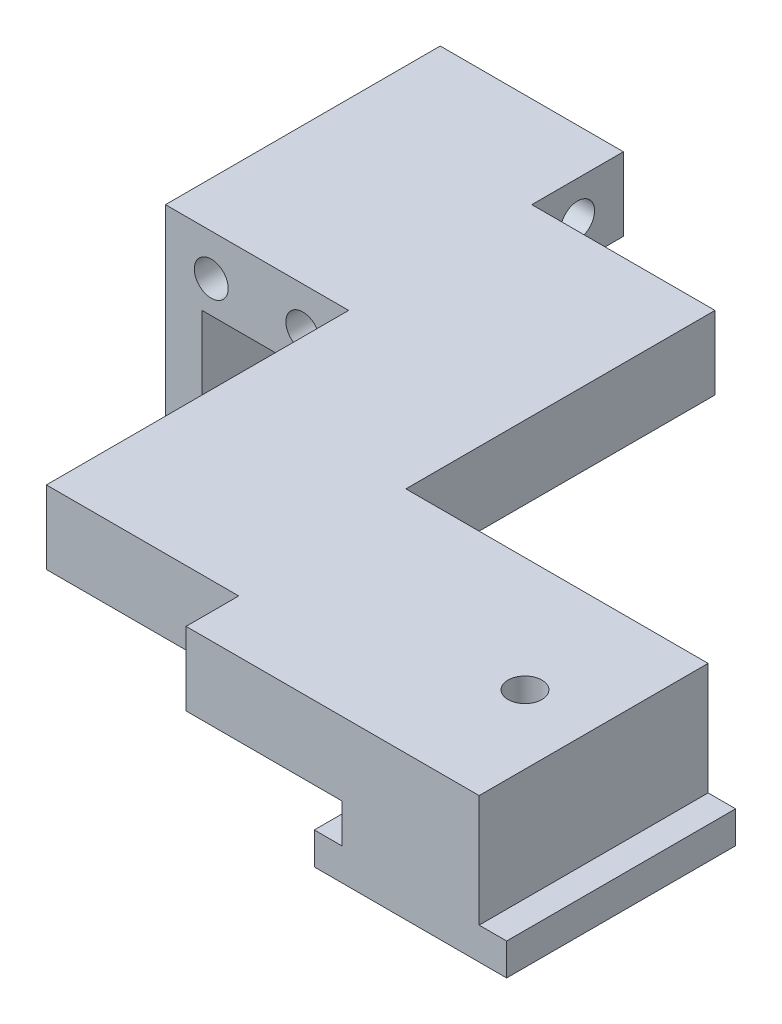
ISO-10303-21;
HEADER;
FILE_DESCRIPTION(('STEP AP214'),'2;1');
FILE_NAME('part.step','',(''),(''),'','','');
FILE_SCHEMA(('AUTOMOTIVE_DESIGN { 1 0 10303 214 1 1 1 1 }'));
ENDSEC;
DATA;
#1=APPLICATION_CONTEXT('core data for automotive mechanical design processes');
#2=APPLICATION_PROTOCOL_DEFINITION('international standard','automotive_design',2000,#1);
#3=PRODUCT_CONTEXT('',#1,'mechanical');
#4=PRODUCT('Part','Part','',(#3));
#5=PRODUCT_RELATED_PRODUCT_CATEGORY('part','',(#4));
#6=PRODUCT_DEFINITION_FORMATION('','',#4);
#7=PRODUCT_DEFINITION_CONTEXT('part definition',#1,'design');
#8=PRODUCT_DEFINITION('design','',#6,#7);
#9=PRODUCT_DEFINITION_SHAPE('','',#8);
#10=(LENGTH_UNIT() NAMED_UNIT(*) SI_UNIT(.MILLI.,.METRE.));
#11=(NAMED_UNIT(*) PLANE_ANGLE_UNIT() SI_UNIT($,.RADIAN.));
#12=(NAMED_UNIT(*) SI_UNIT($,.STERADIAN.) SOLID_ANGLE_UNIT());
#13=UNCERTAINTY_MEASURE_WITH_UNIT(LENGTH_MEASURE(1.E-05),#10,'distance_accuracy_value','');
#14=(GEOMETRIC_REPRESENTATION_CONTEXT(3) GLOBAL_UNCERTAINTY_ASSIGNED_CONTEXT((#13)) GLOBAL_UNIT_ASSIGNED_CONTEXT((#10,
#11,#12)) REPRESENTATION_CONTEXT('',''));
#15=CARTESIAN_POINT('',(0.,0.,0.));
#16=DIRECTION('',(0.,0.,1.));
#17=DIRECTION('',(1.,0.,0.));
#18=AXIS2_PLACEMENT_3D('',#15,#16,#17);
#19=CARTESIAN_POINT('',(-61.5,-7.74999999999999,-56.25));
#20=DIRECTION('',(-1.,0.,0.));
#21=DIRECTION('',(0.,-1.,0.));
#22=AXIS2_PLACEMENT_3D('',#19,#20,#21);
#23=PLANE('',#22);
#24=DIRECTION('',(0.,0.,1.));
#25=VECTOR('',#24,1.);
#26=CARTESIAN_POINT('',(-61.5,-5.49999999999999,-26.25));
#27=LINE('',#26,#25);
#28=CARTESIAN_POINT('',(-61.5,-5.49999999999999,-56.25));
#29=VERTEX_POINT('',#28);
#30=CARTESIAN_POINT('',(-61.5,-5.49999999999999,-26.25));
#31=VERTEX_POINT('',#30);
#32=EDGE_CURVE('E221',#29,#31,#27,.T.);
#33=ORIENTED_EDGE('',*,*,#32,.F.);
#34=DIRECTION('',(0.,1.,0.));
#35=VECTOR('',#34,1.);
#36=CARTESIAN_POINT('',(-61.5,-7.74999999999999,-56.25));
#37=LINE('',#36,#35);
#38=CARTESIAN_POINT('',(-61.5,7.75000000000001,-56.25));
#39=VERTEX_POINT('',#38);
#40=EDGE_CURVE('E238',#29,#39,#37,.T.);
#41=ORIENTED_EDGE('',*,*,#40,.T.);
#42=DIRECTION('',(0.,0.,1.));
#43=VECTOR('',#42,1.);
#44=CARTESIAN_POINT('',(-61.5,7.75000000000001,-56.25));
#45=LINE('',#44,#43);
#46=CARTESIAN_POINT('',(-61.5,7.75000000000001,-26.25));
#47=VERTEX_POINT('',#46);
#48=EDGE_CURVE('E231',#39,#47,#45,.T.);
#49=ORIENTED_EDGE('',*,*,#48,.T.);
#50=DIRECTION('',(0.,1.,0.));
#51=VECTOR('',#50,1.);
#52=CARTESIAN_POINT('',(-61.5,-7.74999999999999,-26.25));
#53=LINE('',#52,#51);
#54=EDGE_CURVE('E206',#31,#47,#53,.T.);
#55=ORIENTED_EDGE('',*,*,#54,.F.);
#56=EDGE_LOOP('',(#33,#41,#49,#55));
#57=FACE_BOUND('',#56,.T.);
#58=ADVANCED_FACE('F39',(#57),#23,.F.);
#59=CARTESIAN_POINT('',(-45.5,7.75000000000001,-12.5));
#60=DIRECTION('',(0.,1.,0.));
#61=DIRECTION('',(-1.,0.,0.));
#62=AXIS2_PLACEMENT_3D('',#59,#60,#61);
#63=PLANE('',#62);
#64=ORIENTED_EDGE('',*,*,#48,.F.);
#65=DIRECTION('',(-1.,0.,0.));
#66=VECTOR('',#65,1.);
#67=CARTESIAN_POINT('',(-65.5,7.75000000000001,-56.25));
#68=LINE('',#67,#66);
#69=CARTESIAN_POINT('',(-45.5,7.75000000000001,-56.25));
#70=VERTEX_POINT('',#69);
#71=EDGE_CURVE('E282',#70,#39,#68,.T.);
#72=ORIENTED_EDGE('',*,*,#71,.F.);
#73=DIRECTION('',(0.,0.,1.));
#74=VECTOR('',#73,1.);
#75=CARTESIAN_POINT('',(-45.5,7.75000000000001,-56.25));
#76=LINE('',#75,#74);
#77=CARTESIAN_POINT('',(-45.5,7.75000000000001,-46.25));
#78=VERTEX_POINT('',#77);
#79=EDGE_CURVE('E285',#70,#78,#76,.T.);
#80=ORIENTED_EDGE('',*,*,#79,.T.);
#81=DIRECTION('',(-1.,0.,0.));
#82=VECTOR('',#81,1.);
#83=CARTESIAN_POINT('',(-25.5,7.75000000000001,-46.25));
#84=LINE('',#83,#82);
#85=CARTESIAN_POINT('',(-25.5,7.75000000000001,-46.25));
#86=VERTEX_POINT('',#85);
#87=EDGE_CURVE('E306',#86,#78,#84,.T.);
#88=ORIENTED_EDGE('',*,*,#87,.F.);
#89=DIRECTION('',(0.,0.,1.));
#90=VECTOR('',#89,1.);
#91=CARTESIAN_POINT('',(-25.5,7.75000000000001,-46.25));
#92=LINE('',#91,#90);
#93=CARTESIAN_POINT('',(-25.5,7.75000000000001,-12.5));
#94=VERTEX_POINT('',#93);
#95=EDGE_CURVE('E315',#86,#94,#92,.T.);
#96=ORIENTED_EDGE('',*,*,#95,.T.);
#97=DIRECTION('',(1.,0.,0.));
#98=VECTOR('',#97,1.);
#99=CARTESIAN_POINT('',(-45.5,7.75000000000001,-12.5));
#100=LINE('',#99,#98);
#101=CARTESIAN_POINT('',(-7.5,7.75,-12.5));
#102=VERTEX_POINT('',#101);
#103=EDGE_CURVE('E328',#94,#102,#100,.T.);
#104=ORIENTED_EDGE('',*,*,#103,.T.);
#105=DIRECTION('',(0.,0.,1.));
#106=VECTOR('',#105,1.);
#107=CARTESIAN_POINT('',(-7.5,7.75,-12.5));
#108=LINE('',#107,#106);
#109=CARTESIAN_POINT('',(-7.5,7.75,12.5));
#110=VERTEX_POINT('',#109);
#111=EDGE_CURVE('E318',#102,#110,#108,.T.);
#112=ORIENTED_EDGE('',*,*,#111,.T.);
#113=DIRECTION('',(1.,0.,0.));
#114=VECTOR('',#113,1.);
#115=CARTESIAN_POINT('',(-45.5,7.75000000000001,12.5));
#116=LINE('',#115,#114);
#117=CARTESIAN_POINT('',(-24.5,7.75,12.5));
#118=VERTEX_POINT('',#117);
#119=EDGE_CURVE('E324',#118,#110,#116,.T.);
#120=ORIENTED_EDGE('',*,*,#119,.F.);
#121=DIRECTION('',(0.,0.,-1.));
#122=VECTOR('',#121,1.);
#123=CARTESIAN_POINT('',(-24.5,7.75,-12.5));
#124=LINE('',#123,#122);
#125=CARTESIAN_POINT('',(-24.5,7.75,6.75));
#126=VERTEX_POINT('',#125);
#127=EDGE_CURVE('E11',#118,#126,#124,.T.);
#128=ORIENTED_EDGE('',*,*,#127,.T.);
#129=DIRECTION('',(-1.,0.,0.));
#130=VECTOR('',#129,1.);
#131=CARTESIAN_POINT('',(-45.5,7.75000000000001,6.75));
#132=LINE('',#131,#130);
#133=CARTESIAN_POINT('',(-45.5,7.75000000000001,6.75));
#134=VERTEX_POINT('',#133);
#135=EDGE_CURVE('E247',#126,#134,#132,.T.);
#136=ORIENTED_EDGE('',*,*,#135,.T.);
#137=DIRECTION('',(0.,0.,1.));
#138=VECTOR('',#137,1.);
#139=CARTESIAN_POINT('',(-45.5,7.75000000000001,-12.5));
#140=LINE('',#139,#138);
#141=CARTESIAN_POINT('',(-45.5,7.75000000000001,-26.25));
#142=VERTEX_POINT('',#141);
#143=EDGE_CURVE('E319',#142,#134,#140,.T.);
#144=ORIENTED_EDGE('',*,*,#143,.F.);
#145=DIRECTION('',(1.,0.,0.));
#146=VECTOR('',#145,1.);
#147=CARTESIAN_POINT('',(-65.5,7.75000000000001,-26.25));
#148=LINE('',#147,#146);
#149=EDGE_CURVE('E300',#47,#142,#148,.T.);
#150=ORIENTED_EDGE('',*,*,#149,.F.);
#151=EDGE_LOOP('',(#64,#72,#80,#88,#96,#104,#112,#120,#128,#136,#144,#150));
#152=FACE_BOUND('',#151,.T.);
#153=ADVANCED_FACE('F393',(#152),#63,.F.);
#154=CARTESIAN_POINT('',(0.,0.,-12.5));
#155=DIRECTION('',(0.,0.,1.));
#156=DIRECTION('',(1.,0.,0.));
#157=AXIS2_PLACEMENT_3D('',#154,#155,#156);
#158=PLANE('',#157);
#159=DIRECTION('',(0.,-1.,0.));
#160=VECTOR('',#159,1.);
#161=CARTESIAN_POINT('',(-25.5,15.75,-12.5));
#162=LINE('',#161,#160);
#163=CARTESIAN_POINT('',(-25.5,15.75,-12.5));
#164=VERTEX_POINT('',#163);
#165=EDGE_CURVE('E302',#164,#94,#162,.T.);
#166=ORIENTED_EDGE('',*,*,#165,.F.);
#167=DIRECTION('',(-1.,0.,0.));
#168=VECTOR('',#167,1.);
#169=CARTESIAN_POINT('',(7.5,15.75,-12.5));
#170=LINE('',#169,#168);
#171=CARTESIAN_POINT('',(7.5,15.75,-12.5));
#172=VERTEX_POINT('',#171);
#173=EDGE_CURVE('E361',#172,#164,#170,.T.);
#174=ORIENTED_EDGE('',*,*,#173,.F.);
#175=DIRECTION('',(0.,1.,0.));
#176=VECTOR('',#175,1.);
#177=CARTESIAN_POINT('',(7.5,3.5,-12.5));
#178=LINE('',#177,#176);
#179=CARTESIAN_POINT('',(7.5,3.5,-12.5));
#180=VERTEX_POINT('',#179);
#181=EDGE_CURVE('E359',#180,#172,#178,.T.);
#182=ORIENTED_EDGE('',*,*,#181,.F.);
#183=DIRECTION('',(-1.,0.,0.));
#184=VECTOR('',#183,1.);
#185=CARTESIAN_POINT('',(10.5,3.5,-12.5));
#186=LINE('',#185,#184);
#187=CARTESIAN_POINT('',(10.5,3.5,-12.5));
#188=VERTEX_POINT('',#187);
#189=EDGE_CURVE('E357',#188,#180,#186,.T.);
#190=ORIENTED_EDGE('',*,*,#189,.F.);
#191=DIRECTION('',(0.,1.,0.));
#192=VECTOR('',#191,1.);
#193=CARTESIAN_POINT('',(10.5,0.,-12.5));
#194=LINE('',#193,#192);
#195=CARTESIAN_POINT('',(10.5,0.,-12.5));
#196=VERTEX_POINT('',#195);
#197=EDGE_CURVE('E355',#196,#188,#194,.T.);
#198=ORIENTED_EDGE('',*,*,#197,.F.);
#199=DIRECTION('',(1.,0.,0.));
#200=VECTOR('',#199,1.);
#201=CARTESIAN_POINT('',(-10.5,0.,-12.5));
#202=LINE('',#201,#200);
#203=CARTESIAN_POINT('',(-10.5,0.,-12.5));
#204=VERTEX_POINT('',#203);
#205=EDGE_CURVE('E353',#204,#196,#202,.T.);
#206=ORIENTED_EDGE('',*,*,#205,.F.);
#207=DIRECTION('',(0.,-1.,0.));
#208=VECTOR('',#207,1.);
#209=CARTESIAN_POINT('',(-10.5,3.5,-12.5));
#210=LINE('',#209,#208);
#211=CARTESIAN_POINT('',(-10.5,3.5,-12.5));
#212=VERTEX_POINT('',#211);
#213=EDGE_CURVE('E330',#212,#204,#210,.T.);
#214=ORIENTED_EDGE('',*,*,#213,.F.);
#215=DIRECTION('',(-1.,0.,0.));
#216=VECTOR('',#215,1.);
#217=CARTESIAN_POINT('',(-7.5,3.5,-12.5));
#218=LINE('',#217,#216);
#219=CARTESIAN_POINT('',(-7.5,3.5,-12.5));
#220=VERTEX_POINT('',#219);
#221=EDGE_CURVE('E335',#220,#212,#218,.T.);
#222=ORIENTED_EDGE('',*,*,#221,.F.);
#223=DIRECTION('',(0.,-1.,0.));
#224=VECTOR('',#223,1.);
#225=CARTESIAN_POINT('',(-7.5,15.75,-12.5));
#226=LINE('',#225,#224);
#227=EDGE_CURVE('E364',#102,#220,#226,.T.);
#228=ORIENTED_EDGE('',*,*,#227,.F.);
#229=ORIENTED_EDGE('',*,*,#103,.F.);
#230=EDGE_LOOP('',(#166,#174,#182,#190,#198,#206,#214,#222,#228,#229));
#231=FACE_BOUND('',#230,.T.);
#232=ADVANCED_FACE('F427',(#231),#158,.F.);
#233=CARTESIAN_POINT('',(-7.5,15.75,12.5));
#234=DIRECTION('',(1.,0.,0.));
#235=DIRECTION('',(0.,1.,0.));
#236=AXIS2_PLACEMENT_3D('',#233,#234,#235);
#237=PLANE('',#236);
#238=ORIENTED_EDGE('',*,*,#111,.F.);
#239=ORIENTED_EDGE('',*,*,#227,.T.);
#240=DIRECTION('',(0.,0.,-1.));
#241=VECTOR('',#240,1.);
#242=CARTESIAN_POINT('',(-7.5,3.5,12.5));
#243=LINE('',#242,#241);
#244=CARTESIAN_POINT('',(-7.5,3.5,12.5));
#245=VERTEX_POINT('',#244);
#246=EDGE_CURVE('E369',#245,#220,#243,.T.);
#247=ORIENTED_EDGE('',*,*,#246,.F.);
#248=DIRECTION('',(0.,-1.,0.));
#249=VECTOR('',#248,1.);
#250=CARTESIAN_POINT('',(-7.5,15.75,12.5));
#251=LINE('',#250,#249);
#252=EDGE_CURVE('E346',#110,#245,#251,.T.);
#253=ORIENTED_EDGE('',*,*,#252,.F.);
#254=EDGE_LOOP('',(#238,#239,#247,#253));
#255=FACE_BOUND('',#254,.T.);
#256=ADVANCED_FACE('F462',(#255),#237,.F.);
#257=CARTESIAN_POINT('',(-10.5,3.5,12.5));
#258=DIRECTION('',(1.,0.,0.));
#259=DIRECTION('',(0.,0.,-1.));
#260=AXIS2_PLACEMENT_3D('',#257,#258,#259);
#261=PLANE('',#260);
#262=ORIENTED_EDGE('',*,*,#213,.T.);
#263=DIRECTION('',(0.,0.,-1.));
#264=VECTOR('',#263,1.);
#265=CARTESIAN_POINT('',(-10.5,0.,12.5));
#266=LINE('',#265,#264);
#267=CARTESIAN_POINT('',(-10.5,0.,12.5));
#268=VERTEX_POINT('',#267);
#269=EDGE_CURVE('E384',#268,#204,#266,.T.);
#270=ORIENTED_EDGE('',*,*,#269,.F.);
#271=DIRECTION('',(0.,-1.,0.));
#272=VECTOR('',#271,1.);
#273=CARTESIAN_POINT('',(-10.5,3.5,12.5));
#274=LINE('',#273,#272);
#275=CARTESIAN_POINT('',(-10.5,3.5,12.5));
#276=VERTEX_POINT('',#275);
#277=EDGE_CURVE('E331',#276,#268,#274,.T.);
#278=ORIENTED_EDGE('',*,*,#277,.F.);
#279=DIRECTION('',(0.,0.,-1.));
#280=VECTOR('',#279,1.);
#281=CARTESIAN_POINT('',(-10.5,3.5,12.5));
#282=LINE('',#281,#280);
#283=EDGE_CURVE('E350',#276,#212,#282,.T.);
#284=ORIENTED_EDGE('',*,*,#283,.T.);
#285=EDGE_LOOP('',(#262,#270,#278,#284));
#286=FACE_BOUND('',#285,.T.);
#287=ADVANCED_FACE('F41',(#286),#261,.F.);
#288=CARTESIAN_POINT('',(-10.5,0.,12.5));
#289=DIRECTION('',(0.,1.,0.));
#290=DIRECTION('',(0.,0.,1.));
#291=AXIS2_PLACEMENT_3D('',#288,#289,#290);
#292=PLANE('',#291);
#293=CARTESIAN_POINT('',(0.,0.,0.));
#294=DIRECTION('',(0.,1.,0.));
#295=DIRECTION('',(0.,0.,1.));
#296=AXIS2_PLACEMENT_3D('',#293,#294,#295);
#297=CIRCLE('',#296,1.85);
#298=CARTESIAN_POINT('',(0.,0.,1.85));
#299=VERTEX_POINT('',#298);
#300=EDGE_CURVE('E254',#299,#299,#297,.T.);
#301=ORIENTED_EDGE('',*,*,#300,.T.);
#302=EDGE_LOOP('',(#301));
#303=FACE_BOUND('',#302,.T.);
#304=ORIENTED_EDGE('',*,*,#205,.T.);
#305=DIRECTION('',(0.,0.,-1.));
#306=VECTOR('',#305,1.);
#307=CARTESIAN_POINT('',(10.5,0.,12.5));
#308=LINE('',#307,#306);
#309=CARTESIAN_POINT('',(10.5,0.,12.5));
#310=VERTEX_POINT('',#309);
#311=EDGE_CURVE('E381',#310,#196,#308,.T.);
#312=ORIENTED_EDGE('',*,*,#311,.F.);
#313=DIRECTION('',(1.,0.,0.));
#314=VECTOR('',#313,1.);
#315=CARTESIAN_POINT('',(-10.5,0.,12.5));
#316=LINE('',#315,#314);
#317=EDGE_CURVE('E334',#268,#310,#316,.T.);
#318=ORIENTED_EDGE('',*,*,#317,.F.);
#319=ORIENTED_EDGE('',*,*,#269,.T.);
#320=EDGE_LOOP('',(#304,#312,#318,#319));
#321=FACE_BOUND('',#320,.T.);
#322=ADVANCED_FACE('F448',(#303,#321),#292,.F.);
#323=CARTESIAN_POINT('',(10.5,0.,12.5));
#324=DIRECTION('',(-1.,0.,0.));
#325=DIRECTION('',(0.,0.,1.));
#326=AXIS2_PLACEMENT_3D('',#323,#324,#325);
#327=PLANE('',#326);
#328=ORIENTED_EDGE('',*,*,#197,.T.);
#329=DIRECTION('',(0.,0.,-1.));
#330=VECTOR('',#329,1.);
#331=CARTESIAN_POINT('',(10.5,3.5,12.5));
#332=LINE('',#331,#330);
#333=CARTESIAN_POINT('',(10.5,3.5,12.5));
#334=VERTEX_POINT('',#333);
#335=EDGE_CURVE('E378',#334,#188,#332,.T.);
#336=ORIENTED_EDGE('',*,*,#335,.F.);
#337=DIRECTION('',(0.,1.,0.));
#338=VECTOR('',#337,1.);
#339=CARTESIAN_POINT('',(10.5,0.,12.5));
#340=LINE('',#339,#338);
#341=EDGE_CURVE('E337',#310,#334,#340,.T.);
#342=ORIENTED_EDGE('',*,*,#341,.F.);
#343=ORIENTED_EDGE('',*,*,#311,.T.);
#344=EDGE_LOOP('',(#328,#336,#342,#343));
#345=FACE_BOUND('',#344,.T.);
#346=ADVANCED_FACE('F445',(#345),#327,.F.);
#347=CARTESIAN_POINT('',(10.5,3.5,12.5));
#348=DIRECTION('',(0.,-1.,0.));
#349=DIRECTION('',(1.,0.,0.));
#350=AXIS2_PLACEMENT_3D('',#347,#348,#349);
#351=PLANE('',#350);
#352=ORIENTED_EDGE('',*,*,#189,.T.);
#353=DIRECTION('',(0.,0.,-1.));
#354=VECTOR('',#353,1.);
#355=CARTESIAN_POINT('',(7.5,3.5,12.5));
#356=LINE('',#355,#354);
#357=CARTESIAN_POINT('',(7.5,3.5,12.5));
#358=VERTEX_POINT('',#357);
#359=EDGE_CURVE('E375',#358,#180,#356,.T.);
#360=ORIENTED_EDGE('',*,*,#359,.F.);
#361=DIRECTION('',(-1.,0.,0.));
#362=VECTOR('',#361,1.);
#363=CARTESIAN_POINT('',(10.5,3.5,12.5));
#364=LINE('',#363,#362);
#365=EDGE_CURVE('E339',#334,#358,#364,.T.);
#366=ORIENTED_EDGE('',*,*,#365,.F.);
#367=ORIENTED_EDGE('',*,*,#335,.T.);
#368=EDGE_LOOP('',(#352,#360,#366,#367));
#369=FACE_BOUND('',#368,.T.);
#370=ADVANCED_FACE('F440',(#369),#351,.F.);
#371=CARTESIAN_POINT('',(7.5,3.5,12.5));
#372=DIRECTION('',(-1.,0.,0.));
#373=DIRECTION('',(0.,-1.,0.));
#374=AXIS2_PLACEMENT_3D('',#371,#372,#373);
#375=PLANE('',#374);
#376=ORIENTED_EDGE('',*,*,#181,.T.);
#377=DIRECTION('',(0.,0.,-1.));
#378=VECTOR('',#377,1.);
#379=CARTESIAN_POINT('',(7.5,15.75,12.5));
#380=LINE('',#379,#378);
#381=CARTESIAN_POINT('',(7.5,15.75,12.5));
#382=VERTEX_POINT('',#381);
#383=EDGE_CURVE('E372',#382,#172,#380,.T.);
#384=ORIENTED_EDGE('',*,*,#383,.F.);
#385=DIRECTION('',(0.,1.,0.));
#386=VECTOR('',#385,1.);
#387=CARTESIAN_POINT('',(7.5,3.5,12.5));
#388=LINE('',#387,#386);
#389=EDGE_CURVE('E341',#358,#382,#388,.T.);
#390=ORIENTED_EDGE('',*,*,#389,.F.);
#391=ORIENTED_EDGE('',*,*,#359,.T.);
#392=EDGE_LOOP('',(#376,#384,#390,#391));
#393=FACE_BOUND('',#392,.T.);
#394=ADVANCED_FACE('F435',(#393),#375,.F.);
#395=CARTESIAN_POINT('',(7.5,15.75,12.5));
#396=DIRECTION('',(0.,-1.,0.));
#397=DIRECTION('',(0.,0.,-1.));
#398=AXIS2_PLACEMENT_3D('',#395,#396,#397);
#399=PLANE('',#398);
#400=CARTESIAN_POINT('',(0.,15.75,0.));
#401=DIRECTION('',(0.,1.,0.));
#402=DIRECTION('',(0.,0.,1.));
#403=AXIS2_PLACEMENT_3D('',#400,#401,#402);
#404=CIRCLE('',#403,1.85);
#405=CARTESIAN_POINT('',(0.,15.75,1.85));
#406=VERTEX_POINT('',#405);
#407=EDGE_CURVE('E251',#406,#406,#404,.T.);
#408=ORIENTED_EDGE('',*,*,#407,.F.);
#409=EDGE_LOOP('',(#408));
#410=FACE_BOUND('',#409,.T.);
#411=DIRECTION('',(0.,0.,-1.));
#412=VECTOR('',#411,1.);
#413=CARTESIAN_POINT('',(-45.5,15.75,-12.5));
#414=LINE('',#413,#412);
#415=CARTESIAN_POINT('',(-45.5,15.75,6.75));
#416=VERTEX_POINT('',#415);
#417=CARTESIAN_POINT('',(-45.5,15.75,-26.25));
#418=VERTEX_POINT('',#417);
#419=EDGE_CURVE('E322',#416,#418,#414,.T.);
#420=ORIENTED_EDGE('',*,*,#419,.F.);
#421=DIRECTION('',(-1.,0.,0.));
#422=VECTOR('',#421,1.);
#423=CARTESIAN_POINT('',(-45.5,15.75,6.75));
#424=LINE('',#423,#422);
#425=CARTESIAN_POINT('',(-24.5,15.75,6.75));
#426=VERTEX_POINT('',#425);
#427=EDGE_CURVE('E54',#426,#416,#424,.T.);
#428=ORIENTED_EDGE('',*,*,#427,.F.);
#429=DIRECTION('',(0.,0.,-1.));
#430=VECTOR('',#429,1.);
#431=CARTESIAN_POINT('',(-24.5,15.75,12.5));
#432=LINE('',#431,#430);
#433=CARTESIAN_POINT('',(-24.5,15.75,12.5));
#434=VERTEX_POINT('',#433);
#435=EDGE_CURVE('E240',#434,#426,#432,.T.);
#436=ORIENTED_EDGE('',*,*,#435,.F.);
#437=DIRECTION('',(-1.,0.,0.));
#438=VECTOR('',#437,1.);
#439=CARTESIAN_POINT('',(7.5,15.75,12.5));
#440=LINE('',#439,#438);
#441=EDGE_CURVE('E343',#382,#434,#440,.T.);
#442=ORIENTED_EDGE('',*,*,#441,.F.);
#443=ORIENTED_EDGE('',*,*,#383,.T.);
#444=ORIENTED_EDGE('',*,*,#173,.T.);
#445=DIRECTION('',(0.,0.,1.));
#446=VECTOR('',#445,1.);
#447=CARTESIAN_POINT('',(-25.5,15.75,-46.25));
#448=LINE('',#447,#446);
#449=CARTESIAN_POINT('',(-25.5,15.75,-46.25));
#450=VERTEX_POINT('',#449);
#451=EDGE_CURVE('E310',#450,#164,#448,.T.);
#452=ORIENTED_EDGE('',*,*,#451,.F.);
#453=DIRECTION('',(1.,0.,0.));
#454=VECTOR('',#453,1.);
#455=CARTESIAN_POINT('',(-25.5,15.75,-46.25));
#456=LINE('',#455,#454);
#457=CARTESIAN_POINT('',(-45.5,15.75,-46.25));
#458=VERTEX_POINT('',#457);
#459=EDGE_CURVE('E308',#458,#450,#456,.T.);
#460=ORIENTED_EDGE('',*,*,#459,.F.);
#461=DIRECTION('',(0.,0.,1.));
#462=VECTOR('',#461,1.);
#463=CARTESIAN_POINT('',(-45.5,15.75,-56.25));
#464=LINE('',#463,#462);
#465=CARTESIAN_POINT('',(-45.5,15.75,-56.25));
#466=VERTEX_POINT('',#465);
#467=EDGE_CURVE('E289',#466,#458,#464,.T.);
#468=ORIENTED_EDGE('',*,*,#467,.F.);
#469=DIRECTION('',(1.,0.,0.));
#470=VECTOR('',#469,1.);
#471=CARTESIAN_POINT('',(-65.5,15.75,-56.25));
#472=LINE('',#471,#470);
#473=CARTESIAN_POINT('',(-65.5,15.75,-56.25));
#474=VERTEX_POINT('',#473);
#475=EDGE_CURVE('E278',#474,#466,#472,.T.);
#476=ORIENTED_EDGE('',*,*,#475,.F.);
#477=DIRECTION('',(0.,0.,-1.));
#478=VECTOR('',#477,1.);
#479=CARTESIAN_POINT('',(-65.5,15.75,-46.25));
#480=LINE('',#479,#478);
#481=CARTESIAN_POINT('',(-65.5,15.75,-26.25));
#482=VERTEX_POINT('',#481);
#483=EDGE_CURVE('E294',#482,#474,#480,.T.);
#484=ORIENTED_EDGE('',*,*,#483,.F.);
#485=DIRECTION('',(1.,0.,0.));
#486=VECTOR('',#485,1.);
#487=CARTESIAN_POINT('',(-65.5,15.75,-26.25));
#488=LINE('',#487,#486);
#489=EDGE_CURVE('E296',#482,#418,#488,.T.);
#490=ORIENTED_EDGE('',*,*,#489,.T.);
#491=EDGE_LOOP('',(#420,#428,#436,#442,#443,#444,#452,#460,#468,#476,#484,#490));
#492=FACE_BOUND('',#491,.T.);
#493=ADVANCED_FACE('F400',(#410,#492),#399,.F.);
#494=CARTESIAN_POINT('',(-7.5,3.5,12.5));
#495=DIRECTION('',(0.,-1.,0.));
#496=DIRECTION('',(1.,0.,0.));
#497=AXIS2_PLACEMENT_3D('',#494,#495,#496);
#498=PLANE('',#497);
#499=ORIENTED_EDGE('',*,*,#221,.T.);
#500=ORIENTED_EDGE('',*,*,#283,.F.);
#501=DIRECTION('',(-1.,0.,0.));
#502=VECTOR('',#501,1.);
#503=CARTESIAN_POINT('',(-7.5,3.5,12.5));
#504=LINE('',#503,#502);
#505=EDGE_CURVE('E348',#245,#276,#504,.T.);
#506=ORIENTED_EDGE('',*,*,#505,.F.);
#507=ORIENTED_EDGE('',*,*,#246,.T.);
#508=EDGE_LOOP('',(#499,#500,#506,#507));
#509=FACE_BOUND('',#508,.T.);
#510=ADVANCED_FACE('F457',(#509),#498,.F.);
#511=CARTESIAN_POINT('',(0.,0.,12.5));
#512=DIRECTION('',(0.,0.,1.));
#513=DIRECTION('',(1.,0.,0.));
#514=AXIS2_PLACEMENT_3D('',#511,#512,#513);
#515=PLANE('',#514);
#516=DIRECTION('',(0.,1.,0.));
#517=VECTOR('',#516,1.);
#518=CARTESIAN_POINT('',(-24.5,0.,12.5));
#519=LINE('',#518,#517);
#520=EDGE_CURVE('E244',#118,#434,#519,.T.);
#521=ORIENTED_EDGE('',*,*,#520,.F.);
#522=ORIENTED_EDGE('',*,*,#119,.T.);
#523=ORIENTED_EDGE('',*,*,#252,.T.);
#524=ORIENTED_EDGE('',*,*,#505,.T.);
#525=ORIENTED_EDGE('',*,*,#277,.T.);
#526=ORIENTED_EDGE('',*,*,#317,.T.);
#527=ORIENTED_EDGE('',*,*,#341,.T.);
#528=ORIENTED_EDGE('',*,*,#365,.T.);
#529=ORIENTED_EDGE('',*,*,#389,.T.);
#530=ORIENTED_EDGE('',*,*,#441,.T.);
#531=EDGE_LOOP('',(#521,#522,#523,#524,#525,#526,#527,#528,#529,#530));
#532=FACE_BOUND('',#531,.T.);
#533=ADVANCED_FACE('F465',(#532),#515,.T.);
#534=CARTESIAN_POINT('',(-45.5,0.,0.));
#535=DIRECTION('',(-1.,0.,0.));
#536=DIRECTION('',(0.,-1.,0.));
#537=AXIS2_PLACEMENT_3D('',#534,#535,#536);
#538=PLANE('',#537);
#539=DIRECTION('',(0.,-1.,0.));
#540=VECTOR('',#539,1.);
#541=CARTESIAN_POINT('',(-45.5,0.,6.75));
#542=LINE('',#541,#540);
#543=EDGE_CURVE('E47',#416,#134,#542,.T.);
#544=ORIENTED_EDGE('',*,*,#543,.F.);
#545=ORIENTED_EDGE('',*,*,#419,.T.);
#546=DIRECTION('',(0.,1.,0.));
#547=VECTOR('',#546,1.);
#548=CARTESIAN_POINT('',(-45.5,15.75,-26.25));
#549=LINE('',#548,#547);
#550=EDGE_CURVE('E292',#142,#418,#549,.T.);
#551=ORIENTED_EDGE('',*,*,#550,.F.);
#552=ORIENTED_EDGE('',*,*,#143,.T.);
#553=EDGE_LOOP('',(#544,#545,#551,#552));
#554=FACE_BOUND('',#553,.T.);
#555=ADVANCED_FACE('F397',(#554),#538,.T.);
#556=CARTESIAN_POINT('',(-25.5,15.75,-46.25));
#557=DIRECTION('',(-1.,0.,0.));
#558=DIRECTION('',(0.,0.,1.));
#559=AXIS2_PLACEMENT_3D('',#556,#557,#558);
#560=PLANE('',#559);
#561=ORIENTED_EDGE('',*,*,#165,.T.);
#562=ORIENTED_EDGE('',*,*,#95,.F.);
#563=DIRECTION('',(0.,-1.,0.));
#564=VECTOR('',#563,1.);
#565=CARTESIAN_POINT('',(-25.5,15.75,-46.25));
#566=LINE('',#565,#564);
#567=EDGE_CURVE('E303',#450,#86,#566,.T.);
#568=ORIENTED_EDGE('',*,*,#567,.F.);
#569=ORIENTED_EDGE('',*,*,#451,.T.);
#570=EDGE_LOOP('',(#561,#562,#568,#569));
#571=FACE_BOUND('',#570,.T.);
#572=ADVANCED_FACE('F424',(#571),#560,.F.);
#573=CARTESIAN_POINT('',(0.,0.,-46.25));
#574=DIRECTION('',(0.,0.,-1.));
#575=DIRECTION('',(-1.,0.,0.));
#576=AXIS2_PLACEMENT_3D('',#573,#574,#575);
#577=PLANE('',#576);
#578=DIRECTION('',(0.,-1.,0.));
#579=VECTOR('',#578,1.);
#580=CARTESIAN_POINT('',(-45.5,7.75000000000001,-46.25));
#581=LINE('',#580,#579);
#582=EDGE_CURVE('E62',#458,#78,#581,.T.);
#583=ORIENTED_EDGE('',*,*,#582,.F.);
#584=ORIENTED_EDGE('',*,*,#459,.T.);
#585=ORIENTED_EDGE('',*,*,#567,.T.);
#586=ORIENTED_EDGE('',*,*,#87,.T.);
#587=EDGE_LOOP('',(#583,#584,#585,#586));
#588=FACE_BOUND('',#587,.T.);
#589=ADVANCED_FACE('F421',(#588),#577,.T.);
#590=CARTESIAN_POINT('',(-65.5,15.75,-26.25));
#591=DIRECTION('',(0.,0.,-1.));
#592=DIRECTION('',(-1.,0.,0.));
#593=AXIS2_PLACEMENT_3D('',#590,#591,#592);
#594=PLANE('',#593);
#595=CARTESIAN_POINT('',(-60.5,11.25,-26.25));
#596=DIRECTION('',(0.,0.,1.));
#597=DIRECTION('',(1.,0.,0.));
#598=AXIS2_PLACEMENT_3D('',#595,#596,#597);
#599=CIRCLE('',#598,1.85);
#600=CARTESIAN_POINT('',(-58.65,11.25,-26.25));
#601=VERTEX_POINT('',#600);
#602=EDGE_CURVE('E263',#601,#601,#599,.T.);
#603=ORIENTED_EDGE('',*,*,#602,.F.);
#604=EDGE_LOOP('',(#603));
#605=FACE_BOUND('',#604,.T.);
#606=CARTESIAN_POINT('',(-50.5,11.25,-26.25));
#607=DIRECTION('',(0.,0.,1.));
#608=DIRECTION('',(1.,0.,0.));
#609=AXIS2_PLACEMENT_3D('',#606,#607,#608);
#610=CIRCLE('',#609,1.85);
#611=CARTESIAN_POINT('',(-48.65,11.25,-26.25));
#612=VERTEX_POINT('',#611);
#613=EDGE_CURVE('E269',#612,#612,#610,.T.);
#614=ORIENTED_EDGE('',*,*,#613,.F.);
#615=EDGE_LOOP('',(#614));
#616=FACE_BOUND('',#615,.T.);
#617=ORIENTED_EDGE('',*,*,#550,.T.);
#618=ORIENTED_EDGE('',*,*,#489,.F.);
#619=DIRECTION('',(0.,1.,0.));
#620=VECTOR('',#619,1.);
#621=CARTESIAN_POINT('',(-65.5,15.75,-26.25));
#622=LINE('',#621,#620);
#623=CARTESIAN_POINT('',(-65.5,-7.74999999999999,-26.25));
#624=VERTEX_POINT('',#623);
#625=EDGE_CURVE('E202',#624,#482,#622,.T.);
#626=ORIENTED_EDGE('',*,*,#625,.F.);
#627=DIRECTION('',(-1.,0.,0.));
#628=VECTOR('',#627,1.);
#629=CARTESIAN_POINT('',(-65.5,-7.74999999999999,-26.25));
#630=LINE('',#629,#628);
#631=CARTESIAN_POINT('',(-56.5,-7.74999999999999,-26.25));
#632=VERTEX_POINT('',#631);
#633=EDGE_CURVE('E194',#632,#624,#630,.T.);
#634=ORIENTED_EDGE('',*,*,#633,.F.);
#635=DIRECTION('',(0.,-1.,0.));
#636=VECTOR('',#635,1.);
#637=CARTESIAN_POINT('',(-56.5,-7.74999999999999,-26.25));
#638=LINE('',#637,#636);
#639=CARTESIAN_POINT('',(-56.5,-5.5,-26.25));
#640=VERTEX_POINT('',#639);
#641=EDGE_CURVE('E200',#640,#632,#638,.T.);
#642=ORIENTED_EDGE('',*,*,#641,.F.);
#643=DIRECTION('',(-1.,0.,0.));
#644=VECTOR('',#643,1.);
#645=CARTESIAN_POINT('',(-56.5,-5.5,-26.25));
#646=LINE('',#645,#644);
#647=EDGE_CURVE('E226',#640,#31,#646,.T.);
#648=ORIENTED_EDGE('',*,*,#647,.T.);
#649=ORIENTED_EDGE('',*,*,#54,.T.);
#650=ORIENTED_EDGE('',*,*,#149,.T.);
#651=EDGE_LOOP('',(#617,#618,#626,#634,#642,#648,#649,#650));
#652=FACE_BOUND('',#651,.T.);
#653=ADVANCED_FACE('F197',(#605,#616,#652),#594,.F.);
#654=CARTESIAN_POINT('',(-65.5,0.,0.));
#655=DIRECTION('',(-1.,0.,0.));
#656=DIRECTION('',(0.,0.,1.));
#657=AXIS2_PLACEMENT_3D('',#654,#655,#656);
#658=PLANE('',#657);
#659=CARTESIAN_POINT('',(-65.5,11.75,-51.25));
#660=DIRECTION('',(-1.,0.,0.));
#661=DIRECTION('',(0.,0.,1.));
#662=AXIS2_PLACEMENT_3D('',#659,#660,#661);
#663=CIRCLE('',#662,1.84999999999999);
#664=CARTESIAN_POINT('',(-65.5,11.75,-49.4));
#665=VERTEX_POINT('',#664);
#666=EDGE_CURVE('E257',#665,#665,#663,.T.);
#667=ORIENTED_EDGE('',*,*,#666,.F.);
#668=EDGE_LOOP('',(#667));
#669=FACE_BOUND('',#668,.T.);
#670=ORIENTED_EDGE('',*,*,#483,.T.);
#671=DIRECTION('',(0.,1.,0.));
#672=VECTOR('',#671,1.);
#673=CARTESIAN_POINT('',(-65.5,7.75000000000001,-56.25));
#674=LINE('',#673,#672);
#675=CARTESIAN_POINT('',(-65.5,-7.74999999999999,-56.25));
#676=VERTEX_POINT('',#675);
#677=EDGE_CURVE('E275',#676,#474,#674,.T.);
#678=ORIENTED_EDGE('',*,*,#677,.F.);
#679=DIRECTION('',(0.,0.,-1.));
#680=VECTOR('',#679,1.);
#681=CARTESIAN_POINT('',(-65.5,-7.74999999999999,-56.25));
#682=LINE('',#681,#680);
#683=EDGE_CURVE('E232',#624,#676,#682,.T.);
#684=ORIENTED_EDGE('',*,*,#683,.F.);
#685=ORIENTED_EDGE('',*,*,#625,.T.);
#686=EDGE_LOOP('',(#670,#678,#684,#685));
#687=FACE_BOUND('',#686,.T.);
#688=ADVANCED_FACE('F404',(#669,#687),#658,.T.);
#689=CARTESIAN_POINT('',(-45.5,7.75000000000001,-56.25));
#690=DIRECTION('',(-1.,0.,0.));
#691=DIRECTION('',(0.,0.,1.));
#692=AXIS2_PLACEMENT_3D('',#689,#690,#691);
#693=PLANE('',#692);
#694=CARTESIAN_POINT('',(-45.5,11.75,-51.25));
#695=DIRECTION('',(-1.,0.,0.));
#696=DIRECTION('',(0.,0.,1.));
#697=AXIS2_PLACEMENT_3D('',#694,#695,#696);
#698=CIRCLE('',#697,1.84999999999999);
#699=CARTESIAN_POINT('',(-45.5,11.75,-49.4));
#700=VERTEX_POINT('',#699);
#701=EDGE_CURVE('E260',#700,#700,#698,.T.);
#702=ORIENTED_EDGE('',*,*,#701,.T.);
#703=EDGE_LOOP('',(#702));
#704=FACE_BOUND('',#703,.T.);
#705=ORIENTED_EDGE('',*,*,#582,.T.);
#706=ORIENTED_EDGE('',*,*,#79,.F.);
#707=DIRECTION('',(0.,-1.,0.));
#708=VECTOR('',#707,1.);
#709=CARTESIAN_POINT('',(-45.5,7.75000000000001,-56.25));
#710=LINE('',#709,#708);
#711=EDGE_CURVE('E280',#466,#70,#710,.T.);
#712=ORIENTED_EDGE('',*,*,#711,.F.);
#713=ORIENTED_EDGE('',*,*,#467,.T.);
#714=EDGE_LOOP('',(#705,#706,#712,#713));
#715=FACE_BOUND('',#714,.T.);
#716=ADVANCED_FACE('F418',(#704,#715),#693,.F.);
#717=CARTESIAN_POINT('',(0.,0.,-56.25));
#718=DIRECTION('',(0.,0.,-1.));
#719=DIRECTION('',(-1.,0.,0.));
#720=AXIS2_PLACEMENT_3D('',#717,#718,#719);
#721=PLANE('',#720);
#722=ORIENTED_EDGE('',*,*,#677,.T.);
#723=ORIENTED_EDGE('',*,*,#475,.T.);
#724=ORIENTED_EDGE('',*,*,#711,.T.);
#725=ORIENTED_EDGE('',*,*,#71,.T.);
#726=ORIENTED_EDGE('',*,*,#40,.F.);
#727=DIRECTION('',(-1.,0.,0.));
#728=VECTOR('',#727,1.);
#729=CARTESIAN_POINT('',(-56.5,-5.5,-56.25));
#730=LINE('',#729,#728);
#731=CARTESIAN_POINT('',(-56.5,-5.5,-56.25));
#732=VERTEX_POINT('',#731);
#733=EDGE_CURVE('E229',#732,#29,#730,.T.);
#734=ORIENTED_EDGE('',*,*,#733,.F.);
#735=DIRECTION('',(0.,1.,0.));
#736=VECTOR('',#735,1.);
#737=CARTESIAN_POINT('',(-56.5,-7.74999999999999,-56.25));
#738=LINE('',#737,#736);
#739=CARTESIAN_POINT('',(-56.5,-7.74999999999999,-56.25));
#740=VERTEX_POINT('',#739);
#741=EDGE_CURVE('E215',#740,#732,#738,.T.);
#742=ORIENTED_EDGE('',*,*,#741,.F.);
#743=DIRECTION('',(1.,0.,0.));
#744=VECTOR('',#743,1.);
#745=CARTESIAN_POINT('',(-65.5,-7.74999999999999,-56.25));
#746=LINE('',#745,#744);
#747=EDGE_CURVE('E207',#676,#740,#746,.T.);
#748=ORIENTED_EDGE('',*,*,#747,.F.);
#749=EDGE_LOOP('',(#722,#723,#724,#725,#726,#734,#742,#748));
#750=FACE_BOUND('',#749,.T.);
#751=ADVANCED_FACE('F406',(#750),#721,.T.);
#752=CARTESIAN_POINT('',(-50.5,11.25,-36.25));
#753=DIRECTION('',(0.,0.,1.));
#754=DIRECTION('',(1.,0.,0.));
#755=AXIS2_PLACEMENT_3D('',#752,#753,#754);
#756=CONICAL_SURFACE('',#755,1.85,1.02974425867665);
#757=CARTESIAN_POINT('',(-50.5,11.25,-37.361592145201));
#758=VERTEX_POINT('',#757);
#759=VERTEX_LOOP('',#758);
#760=FACE_BOUND('',#759,.T.);
#761=CARTESIAN_POINT('',(-50.5,11.25,-36.25));
#762=DIRECTION('',(0.,0.,1.));
#763=DIRECTION('',(1.,0.,0.));
#764=AXIS2_PLACEMENT_3D('',#761,#762,#763);
#765=CIRCLE('',#764,1.85);
#766=CARTESIAN_POINT('',(-48.65,11.25,-36.25));
#767=VERTEX_POINT('',#766);
#768=EDGE_CURVE('E272',#767,#767,#765,.T.);
#769=ORIENTED_EDGE('',*,*,#768,.T.);
#770=EDGE_LOOP('',(#769));
#771=FACE_BOUND('',#770,.T.);
#772=ADVANCED_FACE('F553',(#760,#771),#756,.F.);
#773=CARTESIAN_POINT('',(-50.5,11.25,-26.25));
#774=DIRECTION('',(0.,0.,1.));
#775=DIRECTION('',(1.,0.,0.));
#776=AXIS2_PLACEMENT_3D('',#773,#774,#775);
#777=CYLINDRICAL_SURFACE('',#776,1.85);
#778=ORIENTED_EDGE('',*,*,#768,.F.);
#779=EDGE_LOOP('',(#778));
#780=FACE_BOUND('',#779,.T.);
#781=ORIENTED_EDGE('',*,*,#613,.T.);
#782=EDGE_LOOP('',(#781));
#783=FACE_BOUND('',#782,.T.);
#784=ADVANCED_FACE('F564',(#780,#783),#777,.F.);
#785=CARTESIAN_POINT('',(-60.5,11.25,-36.25));
#786=DIRECTION('',(0.,0.,1.));
#787=DIRECTION('',(1.,0.,0.));
#788=AXIS2_PLACEMENT_3D('',#785,#786,#787);
#789=CONICAL_SURFACE('',#788,1.85,1.02974425867665);
#790=CARTESIAN_POINT('',(-60.5,11.25,-37.361592145201));
#791=VERTEX_POINT('',#790);
#792=VERTEX_LOOP('',#791);
#793=FACE_BOUND('',#792,.T.);
#794=CARTESIAN_POINT('',(-60.5,11.25,-36.25));
#795=DIRECTION('',(0.,0.,1.));
#796=DIRECTION('',(1.,0.,0.));
#797=AXIS2_PLACEMENT_3D('',#794,#795,#796);
#798=CIRCLE('',#797,1.85);
#799=CARTESIAN_POINT('',(-58.65,11.25,-36.25));
#800=VERTEX_POINT('',#799);
#801=EDGE_CURVE('E266',#800,#800,#798,.T.);
#802=ORIENTED_EDGE('',*,*,#801,.T.);
#803=EDGE_LOOP('',(#802));
#804=FACE_BOUND('',#803,.T.);
#805=ADVANCED_FACE('F574',(#793,#804),#789,.F.);
#806=CARTESIAN_POINT('',(-60.5,11.25,-26.25));
#807=DIRECTION('',(0.,0.,1.));
#808=DIRECTION('',(1.,0.,0.));
#809=AXIS2_PLACEMENT_3D('',#806,#807,#808);
#810=CYLINDRICAL_SURFACE('',#809,1.85);
#811=ORIENTED_EDGE('',*,*,#801,.F.);
#812=EDGE_LOOP('',(#811));
#813=FACE_BOUND('',#812,.T.);
#814=ORIENTED_EDGE('',*,*,#602,.T.);
#815=EDGE_LOOP('',(#814));
#816=FACE_BOUND('',#815,.T.);
#817=ADVANCED_FACE('F583',(#813,#816),#810,.F.);
#818=CARTESIAN_POINT('',(-65.5,11.75,-51.25));
#819=DIRECTION('',(-1.,0.,0.));
#820=DIRECTION('',(0.,0.,1.));
#821=AXIS2_PLACEMENT_3D('',#818,#819,#820);
#822=CYLINDRICAL_SURFACE('',#821,1.84999999999999);
#823=ORIENTED_EDGE('',*,*,#666,.T.);
#824=EDGE_LOOP('',(#823));
#825=FACE_BOUND('',#824,.T.);
#826=ORIENTED_EDGE('',*,*,#701,.F.);
#827=EDGE_LOOP('',(#826));
#828=FACE_BOUND('',#827,.T.);
#829=ADVANCED_FACE('F476',(#825,#828),#822,.F.);
#830=CARTESIAN_POINT('',(0.,15.75,0.));
#831=DIRECTION('',(0.,1.,0.));
#832=DIRECTION('',(0.,0.,1.));
#833=AXIS2_PLACEMENT_3D('',#830,#831,#832);
#834=CYLINDRICAL_SURFACE('',#833,1.85);
#835=ORIENTED_EDGE('',*,*,#300,.F.);
#836=EDGE_LOOP('',(#835));
#837=FACE_BOUND('',#836,.T.);
#838=ORIENTED_EDGE('',*,*,#407,.T.);
#839=EDGE_LOOP('',(#838));
#840=FACE_BOUND('',#839,.T.);
#841=ADVANCED_FACE('F469',(#837,#840),#834,.F.);
#842=CARTESIAN_POINT('',(-24.5,0.,12.5));
#843=DIRECTION('',(1.,0.,0.));
#844=DIRECTION('',(0.,0.,-1.));
#845=AXIS2_PLACEMENT_3D('',#842,#843,#844);
#846=PLANE('',#845);
#847=ORIENTED_EDGE('',*,*,#520,.T.);
#848=ORIENTED_EDGE('',*,*,#435,.T.);
#849=DIRECTION('',(0.,1.,0.));
#850=VECTOR('',#849,1.);
#851=CARTESIAN_POINT('',(-24.5,0.,6.75));
#852=LINE('',#851,#850);
#853=EDGE_CURVE('E245',#126,#426,#852,.T.);
#854=ORIENTED_EDGE('',*,*,#853,.F.);
#855=ORIENTED_EDGE('',*,*,#127,.F.);
#856=EDGE_LOOP('',(#847,#848,#854,#855));
#857=FACE_BOUND('',#856,.T.);
#858=ADVANCED_FACE('F467',(#857),#846,.F.);
#859=CARTESIAN_POINT('',(-45.5,0.,6.75));
#860=DIRECTION('',(0.,0.,-1.));
#861=DIRECTION('',(-1.,0.,0.));
#862=AXIS2_PLACEMENT_3D('',#859,#860,#861);
#863=PLANE('',#862);
#864=ORIENTED_EDGE('',*,*,#853,.T.);
#865=ORIENTED_EDGE('',*,*,#427,.T.);
#866=ORIENTED_EDGE('',*,*,#543,.T.);
#867=ORIENTED_EDGE('',*,*,#135,.F.);
#868=EDGE_LOOP('',(#864,#865,#866,#867));
#869=FACE_BOUND('',#868,.T.);
#870=ADVANCED_FACE('F386',(#869),#863,.F.);
#871=CARTESIAN_POINT('',(0.,-7.75000000000001,0.));
#872=DIRECTION('',(0.,1.,0.));
#873=DIRECTION('',(-1.,0.,0.));
#874=AXIS2_PLACEMENT_3D('',#871,#872,#873);
#875=PLANE('',#874);
#876=ORIENTED_EDGE('',*,*,#683,.T.);
#877=ORIENTED_EDGE('',*,*,#747,.T.);
#878=DIRECTION('',(0.,0.,-1.));
#879=VECTOR('',#878,1.);
#880=CARTESIAN_POINT('',(-56.5,-7.74999999999999,-26.25));
#881=LINE('',#880,#879);
#882=EDGE_CURVE('E210',#632,#740,#881,.T.);
#883=ORIENTED_EDGE('',*,*,#882,.F.);
#884=ORIENTED_EDGE('',*,*,#633,.T.);
#885=EDGE_LOOP('',(#876,#877,#883,#884));
#886=FACE_BOUND('',#885,.T.);
#887=ADVANCED_FACE('F211',(#886),#875,.F.);
#888=CARTESIAN_POINT('',(-56.5,-5.5,-26.25));
#889=DIRECTION('',(0.,-1.,0.));
#890=DIRECTION('',(1.,0.,0.));
#891=AXIS2_PLACEMENT_3D('',#888,#889,#890);
#892=PLANE('',#891);
#893=ORIENTED_EDGE('',*,*,#32,.T.);
#894=ORIENTED_EDGE('',*,*,#647,.F.);
#895=DIRECTION('',(0.,0.,1.));
#896=VECTOR('',#895,1.);
#897=CARTESIAN_POINT('',(-56.5,-5.5,-26.25));
#898=LINE('',#897,#896);
#899=EDGE_CURVE('E219',#732,#640,#898,.T.);
#900=ORIENTED_EDGE('',*,*,#899,.F.);
#901=ORIENTED_EDGE('',*,*,#733,.T.);
#902=EDGE_LOOP('',(#893,#894,#900,#901));
#903=FACE_BOUND('',#902,.T.);
#904=ADVANCED_FACE('F411',(#903),#892,.F.);
#905=CARTESIAN_POINT('',(-56.5,0.,0.));
#906=DIRECTION('',(-1.,0.,0.));
#907=DIRECTION('',(0.,0.,1.));
#908=AXIS2_PLACEMENT_3D('',#905,#906,#907);
#909=PLANE('',#908);
#910=ORIENTED_EDGE('',*,*,#641,.T.);
#911=ORIENTED_EDGE('',*,*,#882,.T.);
#912=ORIENTED_EDGE('',*,*,#741,.T.);
#913=ORIENTED_EDGE('',*,*,#899,.T.);
#914=EDGE_LOOP('',(#910,#911,#912,#913));
#915=FACE_BOUND('',#914,.T.);
#916=ADVANCED_FACE('F217',(#915),#909,.F.);
#917=CLOSED_SHELL('',(#58,#153,#232,#256,#287,#322,#346,#370,#394,#493,#510,#533,#555,#572,#589,
#653,#688,#716,#751,#772,#784,#805,#817,#829,#841,#858,#870,#887,#904,#916));
#918=MANIFOLD_SOLID_BREP('B2',#917);
#919=ADVANCED_BREP_SHAPE_REPRESENTATION('',(#18,#918),#14);
#920=SHAPE_DEFINITION_REPRESENTATION(#9,#919);
ENDSEC;
END-ISO-10303-21;
